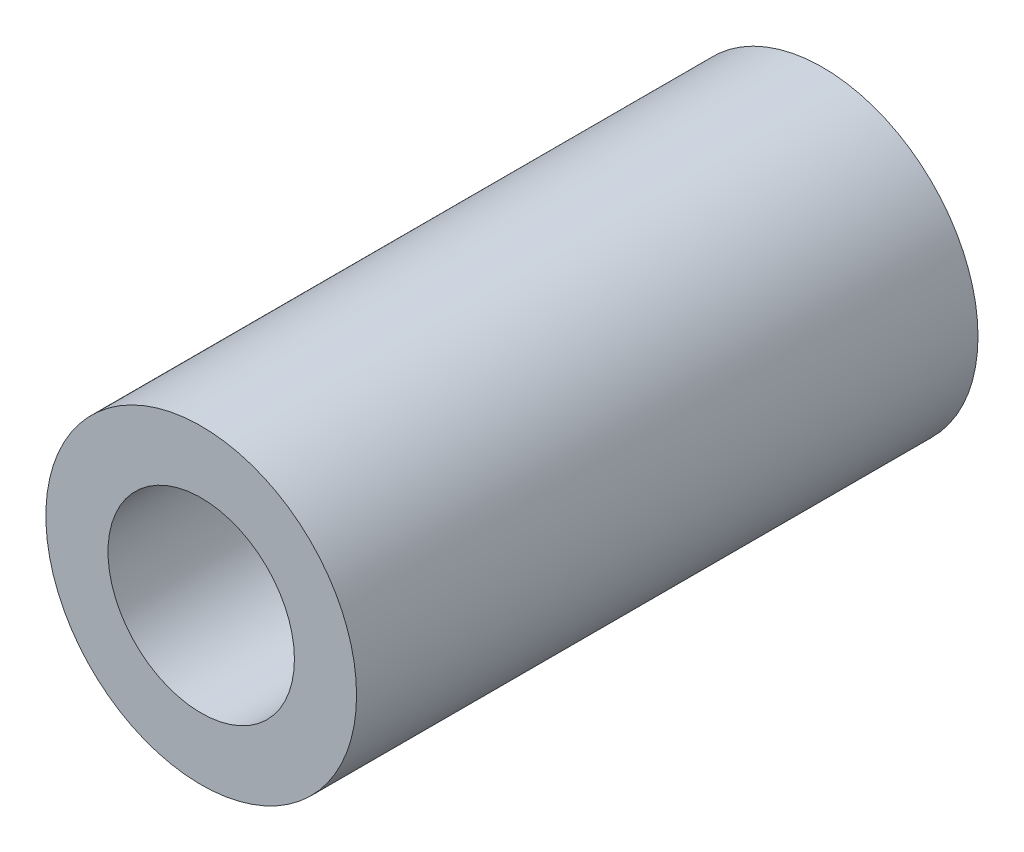
ISO-10303-21;
HEADER;
FILE_DESCRIPTION(('STEP AP214'),'2;1');
FILE_NAME('part.step','',(''),(''),'','','');
FILE_SCHEMA(('AUTOMOTIVE_DESIGN { 1 0 10303 214 1 1 1 1 }'));
ENDSEC;
DATA;
#1=APPLICATION_CONTEXT('core data for automotive mechanical design processes');
#2=APPLICATION_PROTOCOL_DEFINITION('international standard','automotive_design',2000,#1);
#3=PRODUCT_CONTEXT('',#1,'mechanical');
#4=PRODUCT('Part','Part','',(#3));
#5=PRODUCT_RELATED_PRODUCT_CATEGORY('part','',(#4));
#6=PRODUCT_DEFINITION_FORMATION('','',#4);
#7=PRODUCT_DEFINITION_CONTEXT('part definition',#1,'design');
#8=PRODUCT_DEFINITION('design','',#6,#7);
#9=PRODUCT_DEFINITION_SHAPE('','',#8);
#10=(LENGTH_UNIT() NAMED_UNIT(*) SI_UNIT(.MILLI.,.METRE.));
#11=(NAMED_UNIT(*) PLANE_ANGLE_UNIT() SI_UNIT($,.RADIAN.));
#12=(NAMED_UNIT(*) SI_UNIT($,.STERADIAN.) SOLID_ANGLE_UNIT());
#13=UNCERTAINTY_MEASURE_WITH_UNIT(LENGTH_MEASURE(1.E-05),#10,'distance_accuracy_value','');
#14=(GEOMETRIC_REPRESENTATION_CONTEXT(3) GLOBAL_UNCERTAINTY_ASSIGNED_CONTEXT((#13)) GLOBAL_UNIT_ASSIGNED_CONTEXT((#10,
#11,#12)) REPRESENTATION_CONTEXT('',''));
#15=CARTESIAN_POINT('',(0.,0.,0.));
#16=DIRECTION('',(0.,0.,1.));
#17=DIRECTION('',(1.,0.,0.));
#18=AXIS2_PLACEMENT_3D('',#15,#16,#17);
#19=CARTESIAN_POINT('',(0.,0.,10.));
#20=DIRECTION('',(0.,0.,1.));
#21=DIRECTION('',(1.,0.,0.));
#22=AXIS2_PLACEMENT_3D('',#19,#20,#21);
#23=PLANE('',#22);
#24=CARTESIAN_POINT('',(0.,0.,10.));
#25=DIRECTION('',(0.,0.,1.));
#26=DIRECTION('',(1.,0.,0.));
#27=AXIS2_PLACEMENT_3D('',#24,#25,#26);
#28=CIRCLE('',#27,2.5);
#29=CARTESIAN_POINT('',(2.5,0.,10.));
#30=VERTEX_POINT('',#29);
#31=EDGE_CURVE('E10',#30,#30,#28,.T.);
#32=ORIENTED_EDGE('',*,*,#31,.T.);
#33=EDGE_LOOP('',(#32));
#34=FACE_BOUND('',#33,.T.);
#35=CARTESIAN_POINT('',(0.,0.,10.));
#36=DIRECTION('',(0.,0.,1.));
#37=DIRECTION('',(1.,0.,0.));
#38=AXIS2_PLACEMENT_3D('',#35,#36,#37);
#39=CIRCLE('',#38,1.5);
#40=CARTESIAN_POINT('',(1.5,0.,10.));
#41=VERTEX_POINT('',#40);
#42=EDGE_CURVE('E52',#41,#41,#39,.T.);
#43=ORIENTED_EDGE('',*,*,#42,.F.);
#44=EDGE_LOOP('',(#43));
#45=FACE_BOUND('',#44,.T.);
#46=ADVANCED_FACE('F41',(#34,#45),#23,.T.);
#47=CARTESIAN_POINT('',(0.,0.,0.));
#48=DIRECTION('',(0.,0.,1.));
#49=DIRECTION('',(1.,0.,0.));
#50=AXIS2_PLACEMENT_3D('',#47,#48,#49);
#51=PLANE('',#50);
#52=CARTESIAN_POINT('',(0.,0.,0.));
#53=DIRECTION('',(0.,0.,1.));
#54=DIRECTION('',(1.,0.,0.));
#55=AXIS2_PLACEMENT_3D('',#52,#53,#54);
#56=CIRCLE('',#55,2.5);
#57=CARTESIAN_POINT('',(2.5,0.,0.));
#58=VERTEX_POINT('',#57);
#59=EDGE_CURVE('E45',#58,#58,#56,.T.);
#60=ORIENTED_EDGE('',*,*,#59,.F.);
#61=EDGE_LOOP('',(#60));
#62=FACE_BOUND('',#61,.T.);
#63=CARTESIAN_POINT('',(0.,0.,0.));
#64=DIRECTION('',(0.,0.,1.));
#65=DIRECTION('',(1.,0.,0.));
#66=AXIS2_PLACEMENT_3D('',#63,#64,#65);
#67=CIRCLE('',#66,1.5);
#68=CARTESIAN_POINT('',(1.5,0.,0.));
#69=VERTEX_POINT('',#68);
#70=EDGE_CURVE('E54',#69,#69,#67,.T.);
#71=ORIENTED_EDGE('',*,*,#70,.T.);
#72=EDGE_LOOP('',(#71));
#73=FACE_BOUND('',#72,.T.);
#74=ADVANCED_FACE('F64',(#62,#73),#51,.F.);
#75=CARTESIAN_POINT('',(0.,0.,10.));
#76=DIRECTION('',(0.,0.,-1.));
#77=DIRECTION('',(-1.,0.,0.));
#78=AXIS2_PLACEMENT_3D('',#75,#76,#77);
#79=CYLINDRICAL_SURFACE('',#78,2.5);
#80=ORIENTED_EDGE('',*,*,#31,.F.);
#81=EDGE_LOOP('',(#80));
#82=FACE_BOUND('',#81,.T.);
#83=ORIENTED_EDGE('',*,*,#59,.T.);
#84=EDGE_LOOP('',(#83));
#85=FACE_BOUND('',#84,.T.);
#86=ADVANCED_FACE('F43',(#82,#85),#79,.T.);
#87=CARTESIAN_POINT('',(0.,0.,10.));
#88=DIRECTION('',(0.,0.,-1.));
#89=DIRECTION('',(-1.,0.,0.));
#90=AXIS2_PLACEMENT_3D('',#87,#88,#89);
#91=CYLINDRICAL_SURFACE('',#90,1.5);
#92=ORIENTED_EDGE('',*,*,#42,.T.);
#93=EDGE_LOOP('',(#92));
#94=FACE_BOUND('',#93,.T.);
#95=ORIENTED_EDGE('',*,*,#70,.F.);
#96=EDGE_LOOP('',(#95));
#97=FACE_BOUND('',#96,.T.);
#98=ADVANCED_FACE('F60',(#94,#97),#91,.F.);
#99=CLOSED_SHELL('',(#46,#74,#86,#98));
#100=MANIFOLD_SOLID_BREP('B2',#99);
#101=ADVANCED_BREP_SHAPE_REPRESENTATION('',(#18,#100),#14);
#102=SHAPE_DEFINITION_REPRESENTATION(#9,#101);
ENDSEC;
END-ISO-10303-21;
